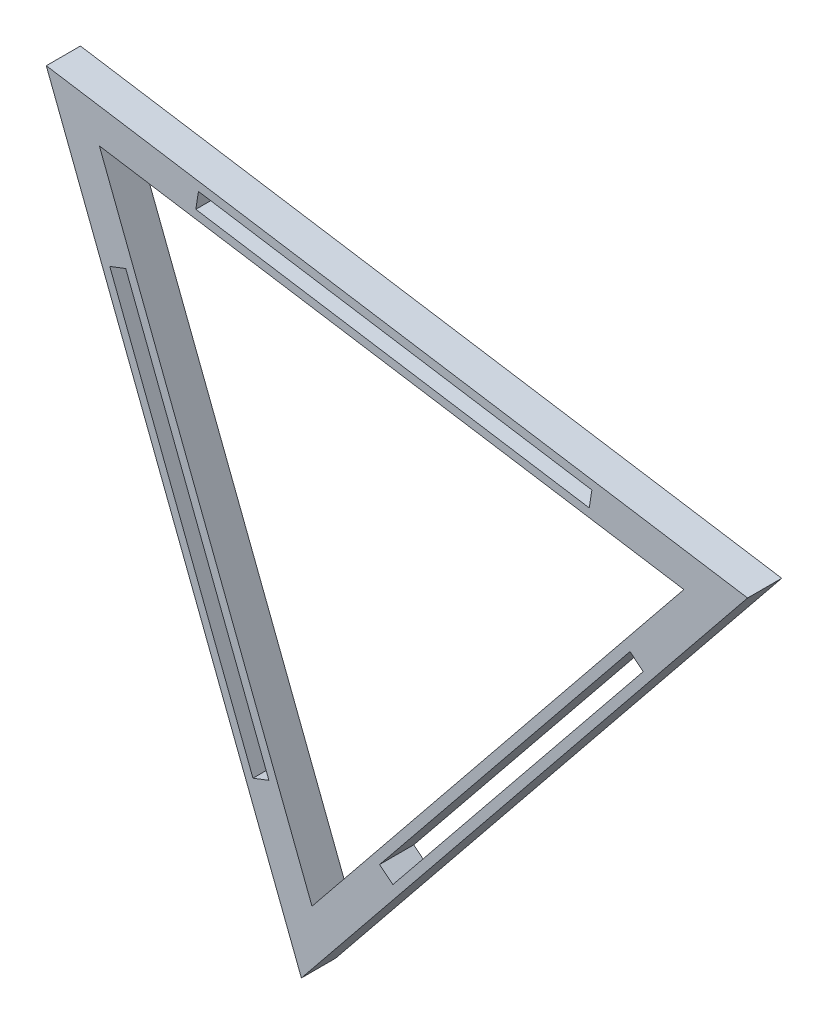
ISO-10303-21;
HEADER;
FILE_DESCRIPTION(('STEP AP214'),'2;1');
FILE_NAME('part.step','',(''),(''),'','','');
FILE_SCHEMA(('AUTOMOTIVE_DESIGN { 1 0 10303 214 1 1 1 1 }'));
ENDSEC;
DATA;
#1=APPLICATION_CONTEXT('core data for automotive mechanical design processes');
#2=APPLICATION_PROTOCOL_DEFINITION('international standard','automotive_design',2000,#1);
#3=PRODUCT_CONTEXT('',#1,'mechanical');
#4=PRODUCT('Part','Part','',(#3));
#5=PRODUCT_RELATED_PRODUCT_CATEGORY('part','',(#4));
#6=PRODUCT_DEFINITION_FORMATION('','',#4);
#7=PRODUCT_DEFINITION_CONTEXT('part definition',#1,'design');
#8=PRODUCT_DEFINITION('design','',#6,#7);
#9=PRODUCT_DEFINITION_SHAPE('','',#8);
#10=(LENGTH_UNIT() NAMED_UNIT(*) SI_UNIT(.MILLI.,.METRE.));
#11=(NAMED_UNIT(*) PLANE_ANGLE_UNIT() SI_UNIT($,.RADIAN.));
#12=(NAMED_UNIT(*) SI_UNIT($,.STERADIAN.) SOLID_ANGLE_UNIT());
#13=UNCERTAINTY_MEASURE_WITH_UNIT(LENGTH_MEASURE(1.E-05),#10,'distance_accuracy_value','');
#14=(GEOMETRIC_REPRESENTATION_CONTEXT(3) GLOBAL_UNCERTAINTY_ASSIGNED_CONTEXT((#13)) GLOBAL_UNIT_ASSIGNED_CONTEXT((#10,
#11,#12)) REPRESENTATION_CONTEXT('',''));
#15=CARTESIAN_POINT('',(0.,0.,0.));
#16=DIRECTION('',(0.,0.,1.));
#17=DIRECTION('',(1.,0.,0.));
#18=AXIS2_PLACEMENT_3D('',#15,#16,#17);
#19=CARTESIAN_POINT('',(0.,0.,6.));
#20=DIRECTION('',(0.,0.,-1.));
#21=DIRECTION('',(-1.,0.,0.));
#22=AXIS2_PLACEMENT_3D('',#19,#20,#21);
#23=PLANE('',#22);
#24=DIRECTION('',(0.155322392432012,0.987863833941296,0.));
#25=VECTOR('',#24,1.);
#26=CARTESIAN_POINT('',(11.977902000133,35.118415815889,6.));
#27=LINE('',#26,#25);
#28=CARTESIAN_POINT('',(11.977902000133,35.118415815889,6.));
#29=VERTEX_POINT('',#28);
#30=CARTESIAN_POINT('',(12.4438691774291,38.0820073177129,6.));
#31=VERTEX_POINT('',#30);
#32=EDGE_CURVE('E178',#29,#31,#27,.T.);
#33=ORIENTED_EDGE('',*,*,#32,.F.);
#34=DIRECTION('',(0.987863833941296,-0.155322392432012,0.));
#35=VECTOR('',#34,1.);
#36=CARTESIAN_POINT('',(-57.1725663757577,45.9909832861298,6.));
#37=LINE('',#36,#35);
#38=CARTESIAN_POINT('',(-57.1725663757577,45.9909832861298,6.));
#39=VERTEX_POINT('',#38);
#40=EDGE_CURVE('E48',#39,#29,#37,.T.);
#41=ORIENTED_EDGE('',*,*,#40,.F.);
#42=DIRECTION('',(0.155322392432012,0.987863833941296,0.));
#43=VECTOR('',#42,1.);
#44=CARTESIAN_POINT('',(-57.1725663757577,45.9909832861298,6.));
#45=LINE('',#44,#43);
#46=CARTESIAN_POINT('',(-56.7065991984616,48.9545747879537,6.));
#47=VERTEX_POINT('',#46);
#48=EDGE_CURVE('E166',#39,#47,#45,.T.);
#49=ORIENTED_EDGE('',*,*,#48,.T.);
#50=DIRECTION('',(0.987863833941296,-0.155322392432012,0.));
#51=VECTOR('',#50,1.);
#52=CARTESIAN_POINT('',(-56.7065991984616,48.9545747879537,6.));
#53=LINE('',#52,#51);
#54=EDGE_CURVE('E172',#47,#31,#53,.T.);
#55=ORIENTED_EDGE('',*,*,#54,.T.);
#56=EDGE_LOOP('',(#33,#41,#49,#55));
#57=FACE_BOUND('',#56,.T.);
#58=DIRECTION('',(0.628780940268043,0.777582490257873,0.));
#59=VECTOR('',#58,1.);
#60=CARTESIAN_POINT('',(-24.8720508241107,-37.5982954158554,6.));
#61=LINE('',#60,#59);
#62=CARTESIAN_POINT('',(-24.8720508241107,-37.5982954158554,6.));
#63=VERTEX_POINT('',#62);
#64=CARTESIAN_POINT('',(19.1426149946523,16.8324789021958,6.));
#65=VERTEX_POINT('',#64);
#66=EDGE_CURVE('E179',#63,#65,#61,.T.);
#67=ORIENTED_EDGE('',*,*,#66,.T.);
#68=DIRECTION('',(0.777582490257874,-0.628780940268043,0.));
#69=VECTOR('',#68,1.);
#70=CARTESIAN_POINT('',(19.1426149946523,16.8324789021958,6.));
#71=LINE('',#70,#69);
#72=CARTESIAN_POINT('',(21.4753624654259,14.9461360813916,6.));
#73=VERTEX_POINT('',#72);
#74=EDGE_CURVE('E182',#65,#73,#71,.T.);
#75=ORIENTED_EDGE('',*,*,#74,.T.);
#76=DIRECTION('',(0.628780940268043,0.777582490257873,0.));
#77=VECTOR('',#76,1.);
#78=CARTESIAN_POINT('',(-22.5393033533371,-39.4846382366595,6.));
#79=LINE('',#78,#77);
#80=CARTESIAN_POINT('',(-22.5393033533371,-39.4846382366595,6.));
#81=VERTEX_POINT('',#80);
#82=EDGE_CURVE('E207',#81,#73,#79,.T.);
#83=ORIENTED_EDGE('',*,*,#82,.F.);
#84=DIRECTION('',(0.777582490257873,-0.628780940268044,0.));
#85=VECTOR('',#84,1.);
#86=CARTESIAN_POINT('',(-24.8720508241107,-37.5982954158554,6.));
#87=LINE('',#86,#85);
#88=EDGE_CURVE('E210',#63,#81,#87,.T.);
#89=ORIENTED_EDGE('',*,*,#88,.F.);
#90=EDGE_LOOP('',(#67,#75,#83,#89));
#91=FACE_BOUND('',#90,.T.);
#92=DIRECTION('',(0.359354366991747,-0.933201178162544,0.));
#93=VECTOR('',#92,1.);
#94=CARTESIAN_POINT('',(-38.6140654621121,-61.7370820134851,6.));
#95=LINE('',#94,#93);
#96=CARTESIAN_POINT('',(-83.455959887873,54.7120627665518,6.));
#97=VERTEX_POINT('',#96);
#98=CARTESIAN_POINT('',(-38.6140654621121,-61.7370820134851,6.));
#99=VERTEX_POINT('',#98);
#100=EDGE_CURVE('E247',#97,#99,#95,.T.);
#101=ORIENTED_EDGE('',*,*,#100,.T.);
#102=DIRECTION('',(0.628498743634432,0.777810599857022,0.));
#103=VECTOR('',#102,1.);
#104=CARTESIAN_POINT('',(39.8129049534864,35.3217101030623,6.));
#105=LINE('',#104,#103);
#106=CARTESIAN_POINT('',(39.8129049534864,35.3217101030623,6.));
#107=VERTEX_POINT('',#106);
#108=EDGE_CURVE('E250',#99,#107,#105,.T.);
#109=ORIENTED_EDGE('',*,*,#108,.T.);
#110=DIRECTION('',(-0.987853110626204,0.155390578305548,0.));
#111=VECTOR('',#110,1.);
#112=CARTESIAN_POINT('',(-83.455959887873,54.7120627665518,6.));
#113=LINE('',#112,#111);
#114=EDGE_CURVE('E253',#107,#97,#113,.T.);
#115=ORIENTED_EDGE('',*,*,#114,.T.);
#116=EDGE_LOOP('',(#101,#109,#115));
#117=FACE_BOUND('',#116,.T.);
#118=DIRECTION('',(-0.987853110626204,0.155390578305548,0.));
#119=VECTOR('',#118,1.);
#120=CARTESIAN_POINT('',(-74.122232689589,47.1700778429383,6.));
#121=LINE('',#120,#119);
#122=CARTESIAN_POINT('',(28.6144908155362,31.0094576991613,6.));
#123=VERTEX_POINT('',#122);
#124=CARTESIAN_POINT('',(-74.122232689589,47.1700778429383,6.));
#125=VERTEX_POINT('',#124);
#126=EDGE_CURVE('E223',#123,#125,#121,.T.);
#127=ORIENTED_EDGE('',*,*,#126,.F.);
#128=DIRECTION('',(0.628498743634432,0.777810599857022,0.));
#129=VECTOR('',#128,1.);
#130=CARTESIAN_POINT('',(28.6144908155362,31.0094576991613,6.));
#131=LINE('',#130,#129);
#132=CARTESIAN_POINT('',(-36.7493785224458,-49.8828446859703,6.));
#133=VERTEX_POINT('',#132);
#134=EDGE_CURVE('E229',#133,#123,#131,.T.);
#135=ORIENTED_EDGE('',*,*,#134,.F.);
#136=DIRECTION('',(0.359354366991747,-0.933201178162544,0.));
#137=VECTOR('',#136,1.);
#138=CARTESIAN_POINT('',(-36.7493785224458,-49.8828446859703,6.));
#139=LINE('',#138,#137);
#140=EDGE_CURVE('E225',#125,#133,#139,.T.);
#141=ORIENTED_EDGE('',*,*,#140,.F.);
#142=EDGE_LOOP('',(#127,#135,#141));
#143=FACE_BOUND('',#142,.T.);
#144=DIRECTION('',(-0.359445221944692,0.933166186925529,0.));
#145=VECTOR('',#144,1.);
#146=CARTESIAN_POINT('',(-47.1278934841825,-35.5783196743348,6.));
#147=LINE('',#146,#145);
#148=CARTESIAN_POINT('',(-47.1278934841825,-35.5783196743348,6.));
#149=VERTEX_POINT('',#148);
#150=CARTESIAN_POINT('',(-72.2890590203109,29.7433134104523,6.));
#151=VERTEX_POINT('',#150);
#152=EDGE_CURVE('E56',#149,#151,#147,.T.);
#153=ORIENTED_EDGE('',*,*,#152,.T.);
#154=DIRECTION('',(0.933166186925529,0.359445221944691,0.));
#155=VECTOR('',#154,1.);
#156=CARTESIAN_POINT('',(-72.2890590203109,29.7433134104523,6.));
#157=LINE('',#156,#155);
#158=CARTESIAN_POINT('',(-69.4895604595343,30.8216490762864,6.));
#159=VERTEX_POINT('',#158);
#160=EDGE_CURVE('E201',#151,#159,#157,.T.);
#161=ORIENTED_EDGE('',*,*,#160,.T.);
#162=DIRECTION('',(-0.359445221944691,0.933166186925529,0.));
#163=VECTOR('',#162,1.);
#164=CARTESIAN_POINT('',(-44.3283949234059,-34.4999840085007,6.));
#165=LINE('',#164,#163);
#166=CARTESIAN_POINT('',(-44.3283949234059,-34.4999840085007,6.));
#167=VERTEX_POINT('',#166);
#168=EDGE_CURVE('E198',#167,#159,#165,.T.);
#169=ORIENTED_EDGE('',*,*,#168,.F.);
#170=DIRECTION('',(0.93316618692553,0.35944522194469,0.));
#171=VECTOR('',#170,1.);
#172=CARTESIAN_POINT('',(-47.1278934841825,-35.5783196743348,6.));
#173=LINE('',#172,#171);
#174=EDGE_CURVE('E195',#149,#167,#173,.T.);
#175=ORIENTED_EDGE('',*,*,#174,.F.);
#176=EDGE_LOOP('',(#153,#161,#169,#175));
#177=FACE_BOUND('',#176,.T.);
#178=ADVANCED_FACE('F33',(#57,#91,#117,#143,#177),#23,.F.);
#179=CARTESIAN_POINT('',(0.,0.,0.));
#180=DIRECTION('',(0.,0.,-1.));
#181=DIRECTION('',(-1.,0.,0.));
#182=AXIS2_PLACEMENT_3D('',#179,#180,#181);
#183=PLANE('',#182);
#184=DIRECTION('',(-0.987863833941296,0.155322392432012,0.));
#185=VECTOR('',#184,1.);
#186=CARTESIAN_POINT('',(5.67744493664427,36.1090402631996,0.));
#187=LINE('',#186,#185);
#188=CARTESIAN_POINT('',(11.977902000133,35.118415815889,0.));
#189=VERTEX_POINT('',#188);
#190=CARTESIAN_POINT('',(-57.1725663757577,45.9909832861298,0.));
#191=VERTEX_POINT('',#190);
#192=EDGE_CURVE('E11',#189,#191,#187,.T.);
#193=ORIENTED_EDGE('',*,*,#192,.F.);
#194=DIRECTION('',(-0.155322392432012,-0.987863833941296,0.));
#195=VECTOR('',#194,1.);
#196=CARTESIAN_POINT('',(6.30045706348877,-0.990624447310617,0.));
#197=LINE('',#196,#195);
#198=CARTESIAN_POINT('',(12.4438691774291,38.0820073177129,0.));
#199=VERTEX_POINT('',#198);
#200=EDGE_CURVE('E291',#199,#189,#197,.T.);
#201=ORIENTED_EDGE('',*,*,#200,.F.);
#202=DIRECTION('',(-0.987863833941296,0.155322392432012,0.));
#203=VECTOR('',#202,1.);
#204=CARTESIAN_POINT('',(6.14341211394031,39.0726317650235,0.));
#205=LINE('',#204,#203);
#206=CARTESIAN_POINT('',(-56.7065991984616,48.9545747879537,0.));
#207=VERTEX_POINT('',#206);
#208=EDGE_CURVE('E293',#199,#207,#205,.T.);
#209=ORIENTED_EDGE('',*,*,#208,.T.);
#210=DIRECTION('',(-0.155322392432012,-0.987863833941296,0.));
#211=VECTOR('',#210,1.);
#212=CARTESIAN_POINT('',(-62.850011312402,9.88194302293023,0.));
#213=LINE('',#212,#211);
#214=EDGE_CURVE('E41',#207,#191,#213,.T.);
#215=ORIENTED_EDGE('',*,*,#214,.T.);
#216=EDGE_LOOP('',(#193,#201,#209,#215));
#217=FACE_BOUND('',#216,.T.);
#218=DIRECTION('',(0.359354366991747,-0.933201178162544,0.));
#219=VECTOR('',#218,1.);
#220=CARTESIAN_POINT('',(-38.6140654621121,-61.7370820134851,0.));
#221=LINE('',#220,#219);
#222=CARTESIAN_POINT('',(-83.455959887873,54.7120627665518,0.));
#223=VERTEX_POINT('',#222);
#224=CARTESIAN_POINT('',(-38.6140654621121,-61.7370820134851,0.));
#225=VERTEX_POINT('',#224);
#226=EDGE_CURVE('E246',#223,#225,#221,.T.);
#227=ORIENTED_EDGE('',*,*,#226,.F.);
#228=DIRECTION('',(-0.987853110626204,0.155390578305548,0.));
#229=VECTOR('',#228,1.);
#230=CARTESIAN_POINT('',(-83.455959887873,54.7120627665518,0.));
#231=LINE('',#230,#229);
#232=CARTESIAN_POINT('',(39.8129049534864,35.3217101030623,0.));
#233=VERTEX_POINT('',#232);
#234=EDGE_CURVE('E251',#233,#223,#231,.T.);
#235=ORIENTED_EDGE('',*,*,#234,.F.);
#236=DIRECTION('',(0.628498743634432,0.777810599857022,0.));
#237=VECTOR('',#236,1.);
#238=CARTESIAN_POINT('',(39.8129049534864,35.3217101030623,0.));
#239=LINE('',#238,#237);
#240=EDGE_CURVE('E258',#225,#233,#239,.T.);
#241=ORIENTED_EDGE('',*,*,#240,.F.);
#242=EDGE_LOOP('',(#227,#235,#241));
#243=FACE_BOUND('',#242,.T.);
#244=DIRECTION('',(0.628498743634432,0.777810599857022,0.));
#245=VECTOR('',#244,1.);
#246=CARTESIAN_POINT('',(28.6144908155362,31.0094576991613,0.));
#247=LINE('',#246,#245);
#248=CARTESIAN_POINT('',(-36.7493785224458,-49.8828446859703,0.));
#249=VERTEX_POINT('',#248);
#250=CARTESIAN_POINT('',(28.6144908155363,31.0094576991613,0.));
#251=VERTEX_POINT('',#250);
#252=EDGE_CURVE('E226',#249,#251,#247,.T.);
#253=ORIENTED_EDGE('',*,*,#252,.T.);
#254=DIRECTION('',(-0.987853110626204,0.155390578305548,0.));
#255=VECTOR('',#254,1.);
#256=CARTESIAN_POINT('',(-74.122232689589,47.1700778429383,0.));
#257=LINE('',#256,#255);
#258=CARTESIAN_POINT('',(-74.122232689589,47.1700778429383,0.));
#259=VERTEX_POINT('',#258);
#260=EDGE_CURVE('E222',#251,#259,#257,.T.);
#261=ORIENTED_EDGE('',*,*,#260,.T.);
#262=DIRECTION('',(0.359354366991747,-0.933201178162544,0.));
#263=VECTOR('',#262,1.);
#264=CARTESIAN_POINT('',(-36.7493785224458,-49.8828446859703,0.));
#265=LINE('',#264,#263);
#266=EDGE_CURVE('E234',#259,#249,#265,.T.);
#267=ORIENTED_EDGE('',*,*,#266,.T.);
#268=EDGE_LOOP('',(#253,#261,#267));
#269=FACE_BOUND('',#268,.T.);
#270=DIRECTION('',(-0.777582490257874,0.628780940268043,0.));
#271=VECTOR('',#270,1.);
#272=CARTESIAN_POINT('',(15.7982168985812,19.5368785071571,0.));
#273=LINE('',#272,#271);
#274=CARTESIAN_POINT('',(21.4753624654259,14.9461360813916,0.));
#275=VERTEX_POINT('',#274);
#276=CARTESIAN_POINT('',(19.1426149946523,16.8324789021958,0.));
#277=VERTEX_POINT('',#276);
#278=EDGE_CURVE('E274',#275,#277,#273,.T.);
#279=ORIENTED_EDGE('',*,*,#278,.T.);
#280=DIRECTION('',(-0.628780940268043,-0.777582490257873,0.));
#281=VECTOR('',#280,1.);
#282=CARTESIAN_POINT('',(3.34439809607111,-2.70439960496134,0.));
#283=LINE('',#282,#281);
#284=CARTESIAN_POINT('',(-24.8720508241107,-37.5982954158554,0.));
#285=VERTEX_POINT('',#284);
#286=EDGE_CURVE('E277',#277,#285,#283,.T.);
#287=ORIENTED_EDGE('',*,*,#286,.T.);
#288=DIRECTION('',(-0.777582490257873,0.628780940268044,0.));
#289=VECTOR('',#288,1.);
#290=CARTESIAN_POINT('',(-28.2164489201819,-34.893895810894,0.));
#291=LINE('',#290,#289);
#292=CARTESIAN_POINT('',(-22.5393033533371,-39.4846382366595,0.));
#293=VERTEX_POINT('',#292);
#294=EDGE_CURVE('E269',#293,#285,#291,.T.);
#295=ORIENTED_EDGE('',*,*,#294,.F.);
#296=DIRECTION('',(-0.628780940268043,-0.777582490257873,0.));
#297=VECTOR('',#296,1.);
#298=CARTESIAN_POINT('',(5.67714556684474,-4.59074242576547,0.));
#299=LINE('',#298,#297);
#300=EDGE_CURVE('E271',#275,#293,#299,.T.);
#301=ORIENTED_EDGE('',*,*,#300,.F.);
#302=EDGE_LOOP('',(#279,#287,#295,#301));
#303=FACE_BOUND('',#302,.T.);
#304=DIRECTION('',(-0.933166186925529,-0.359445221944691,0.));
#305=VECTOR('',#304,1.);
#306=CARTESIAN_POINT('',(-19.3163745951238,50.1478014609147,0.));
#307=LINE('',#306,#305);
#308=CARTESIAN_POINT('',(-69.4895604595343,30.8216490762864,0.));
#309=VERTEX_POINT('',#308);
#310=CARTESIAN_POINT('',(-72.2890590203109,29.7433134104523,0.));
#311=VERTEX_POINT('',#310);
#312=EDGE_CURVE('E285',#309,#311,#307,.T.);
#313=ORIENTED_EDGE('',*,*,#312,.T.);
#314=DIRECTION('',(0.359445221944692,-0.933166186925529,0.));
#315=VECTOR('',#314,1.);
#316=CARTESIAN_POINT('',(-52.9726844251872,-20.4044880504624,0.));
#317=LINE('',#316,#315);
#318=CARTESIAN_POINT('',(-47.1278934841825,-35.5783196743348,0.));
#319=VERTEX_POINT('',#318);
#320=EDGE_CURVE('E288',#311,#319,#317,.T.);
#321=ORIENTED_EDGE('',*,*,#320,.T.);
#322=DIRECTION('',(-0.93316618692553,-0.35944522194469,0.));
#323=VECTOR('',#322,1.);
#324=CARTESIAN_POINT('',(5.84479094100466,-15.1738316238725,0.));
#325=LINE('',#324,#323);
#326=CARTESIAN_POINT('',(-44.3283949234059,-34.4999840085007,0.));
#327=VERTEX_POINT('',#326);
#328=EDGE_CURVE('E280',#327,#319,#325,.T.);
#329=ORIENTED_EDGE('',*,*,#328,.F.);
#330=DIRECTION('',(0.359445221944691,-0.933166186925529,0.));
#331=VECTOR('',#330,1.);
#332=CARTESIAN_POINT('',(-50.1731858644106,-19.3261523846283,0.));
#333=LINE('',#332,#331);
#334=EDGE_CURVE('E282',#309,#327,#333,.T.);
#335=ORIENTED_EDGE('',*,*,#334,.F.);
#336=EDGE_LOOP('',(#313,#321,#329,#335));
#337=FACE_BOUND('',#336,.T.);
#338=ADVANCED_FACE('F296',(#217,#243,#269,#303,#337),#183,.T.);
#339=CARTESIAN_POINT('',(-38.6140654621121,-61.7370820134851,6.));
#340=DIRECTION('',(0.933201178162544,0.359354366991747,0.));
#341=DIRECTION('',(-0.359354366991747,0.933201178162544,0.));
#342=AXIS2_PLACEMENT_3D('',#339,#340,#341);
#343=PLANE('',#342);
#344=ORIENTED_EDGE('',*,*,#226,.T.);
#345=DIRECTION('',(0.,0.,-1.));
#346=VECTOR('',#345,1.);
#347=CARTESIAN_POINT('',(-38.6140654621121,-61.7370820134851,6.));
#348=LINE('',#347,#346);
#349=EDGE_CURVE('E266',#99,#225,#348,.T.);
#350=ORIENTED_EDGE('',*,*,#349,.F.);
#351=ORIENTED_EDGE('',*,*,#100,.F.);
#352=DIRECTION('',(0.,0.,-1.));
#353=VECTOR('',#352,1.);
#354=CARTESIAN_POINT('',(-83.455959887873,54.7120627665518,6.));
#355=LINE('',#354,#353);
#356=EDGE_CURVE('E255',#97,#223,#355,.T.);
#357=ORIENTED_EDGE('',*,*,#356,.T.);
#358=EDGE_LOOP('',(#344,#350,#351,#357));
#359=FACE_BOUND('',#358,.T.);
#360=ADVANCED_FACE('F35',(#359),#343,.F.);
#361=CARTESIAN_POINT('',(39.8129049534864,35.3217101030623,6.));
#362=DIRECTION('',(-0.777810599857022,0.628498743634432,0.));
#363=DIRECTION('',(-0.628498743634432,-0.777810599857022,0.));
#364=AXIS2_PLACEMENT_3D('',#361,#362,#363);
#365=PLANE('',#364);
#366=ORIENTED_EDGE('',*,*,#240,.T.);
#367=DIRECTION('',(0.,0.,-1.));
#368=VECTOR('',#367,1.);
#369=CARTESIAN_POINT('',(39.8129049534864,35.3217101030623,6.));
#370=LINE('',#369,#368);
#371=EDGE_CURVE('E263',#107,#233,#370,.T.);
#372=ORIENTED_EDGE('',*,*,#371,.F.);
#373=ORIENTED_EDGE('',*,*,#108,.F.);
#374=ORIENTED_EDGE('',*,*,#349,.T.);
#375=EDGE_LOOP('',(#366,#372,#373,#374));
#376=FACE_BOUND('',#375,.T.);
#377=ADVANCED_FACE('F327',(#376),#365,.F.);
#378=CARTESIAN_POINT('',(-83.455959887873,54.7120627665518,6.));
#379=DIRECTION('',(-0.155390578305548,-0.987853110626204,0.));
#380=DIRECTION('',(0.987853110626204,-0.155390578305548,0.));
#381=AXIS2_PLACEMENT_3D('',#378,#379,#380);
#382=PLANE('',#381);
#383=ORIENTED_EDGE('',*,*,#234,.T.);
#384=ORIENTED_EDGE('',*,*,#356,.F.);
#385=ORIENTED_EDGE('',*,*,#114,.F.);
#386=ORIENTED_EDGE('',*,*,#371,.T.);
#387=EDGE_LOOP('',(#383,#384,#385,#386));
#388=FACE_BOUND('',#387,.T.);
#389=ADVANCED_FACE('F325',(#388),#382,.F.);
#390=CARTESIAN_POINT('',(-74.122232689589,47.1700778429383,6.));
#391=DIRECTION('',(-0.155390578305548,-0.987853110626204,0.));
#392=DIRECTION('',(0.987853110626204,-0.155390578305548,0.));
#393=AXIS2_PLACEMENT_3D('',#390,#391,#392);
#394=PLANE('',#393);
#395=ORIENTED_EDGE('',*,*,#260,.F.);
#396=DIRECTION('',(0.,0.,-1.));
#397=VECTOR('',#396,1.);
#398=CARTESIAN_POINT('',(28.6144908155362,31.0094576991613,6.));
#399=LINE('',#398,#397);
#400=EDGE_CURVE('E231',#123,#251,#399,.T.);
#401=ORIENTED_EDGE('',*,*,#400,.F.);
#402=ORIENTED_EDGE('',*,*,#126,.T.);
#403=DIRECTION('',(0.,0.,-1.));
#404=VECTOR('',#403,1.);
#405=CARTESIAN_POINT('',(-74.122232689589,47.1700778429383,6.));
#406=LINE('',#405,#404);
#407=EDGE_CURVE('E243',#125,#259,#406,.T.);
#408=ORIENTED_EDGE('',*,*,#407,.T.);
#409=EDGE_LOOP('',(#395,#401,#402,#408));
#410=FACE_BOUND('',#409,.T.);
#411=ADVANCED_FACE('F322',(#410),#394,.T.);
#412=CARTESIAN_POINT('',(-36.7493785224458,-49.8828446859703,6.));
#413=DIRECTION('',(0.933201178162544,0.359354366991747,0.));
#414=DIRECTION('',(-0.359354366991747,0.933201178162544,0.));
#415=AXIS2_PLACEMENT_3D('',#412,#413,#414);
#416=PLANE('',#415);
#417=ORIENTED_EDGE('',*,*,#266,.F.);
#418=ORIENTED_EDGE('',*,*,#407,.F.);
#419=ORIENTED_EDGE('',*,*,#140,.T.);
#420=DIRECTION('',(0.,0.,-1.));
#421=VECTOR('',#420,1.);
#422=CARTESIAN_POINT('',(-36.7493785224458,-49.8828446859703,6.));
#423=LINE('',#422,#421);
#424=EDGE_CURVE('E241',#133,#249,#423,.T.);
#425=ORIENTED_EDGE('',*,*,#424,.T.);
#426=EDGE_LOOP('',(#417,#418,#419,#425));
#427=FACE_BOUND('',#426,.T.);
#428=ADVANCED_FACE('F392',(#427),#416,.T.);
#429=CARTESIAN_POINT('',(28.6144908155362,31.0094576991613,6.));
#430=DIRECTION('',(-0.777810599857022,0.628498743634432,0.));
#431=DIRECTION('',(-0.628498743634432,-0.777810599857022,0.));
#432=AXIS2_PLACEMENT_3D('',#429,#430,#431);
#433=PLANE('',#432);
#434=ORIENTED_EDGE('',*,*,#252,.F.);
#435=ORIENTED_EDGE('',*,*,#424,.F.);
#436=ORIENTED_EDGE('',*,*,#134,.T.);
#437=ORIENTED_EDGE('',*,*,#400,.T.);
#438=EDGE_LOOP('',(#434,#435,#436,#437));
#439=FACE_BOUND('',#438,.T.);
#440=ADVANCED_FACE('F389',(#439),#433,.T.);
#441=CARTESIAN_POINT('',(-24.8720508241107,-37.5982954158554,-4.));
#442=DIRECTION('',(0.777582490257873,-0.628780940268043,0.));
#443=DIRECTION('',(0.628780940268043,0.777582490257873,0.));
#444=AXIS2_PLACEMENT_3D('',#441,#442,#443);
#445=PLANE('',#444);
#446=DIRECTION('',(0.,0.,1.));
#447=VECTOR('',#446,1.);
#448=CARTESIAN_POINT('',(19.1426149946523,16.8324789021958,-4.));
#449=LINE('',#448,#447);
#450=EDGE_CURVE('E220',#277,#65,#449,.T.);
#451=ORIENTED_EDGE('',*,*,#450,.T.);
#452=ORIENTED_EDGE('',*,*,#66,.F.);
#453=DIRECTION('',(0.,0.,1.));
#454=VECTOR('',#453,1.);
#455=CARTESIAN_POINT('',(-24.8720508241107,-37.5982954158554,-4.));
#456=LINE('',#455,#454);
#457=EDGE_CURVE('E213',#285,#63,#456,.T.);
#458=ORIENTED_EDGE('',*,*,#457,.F.);
#459=ORIENTED_EDGE('',*,*,#286,.F.);
#460=EDGE_LOOP('',(#451,#452,#458,#459));
#461=FACE_BOUND('',#460,.T.);
#462=ADVANCED_FACE('F385',(#461),#445,.T.);
#463=CARTESIAN_POINT('',(19.1426149946523,16.8324789021958,-4.));
#464=DIRECTION('',(-0.628780940268043,-0.777582490257874,0.));
#465=DIRECTION('',(0.777582490257874,-0.628780940268043,0.));
#466=AXIS2_PLACEMENT_3D('',#463,#464,#465);
#467=PLANE('',#466);
#468=DIRECTION('',(0.,0.,1.));
#469=VECTOR('',#468,1.);
#470=CARTESIAN_POINT('',(21.4753624654259,14.9461360813916,-4.));
#471=LINE('',#470,#469);
#472=EDGE_CURVE('E218',#275,#73,#471,.T.);
#473=ORIENTED_EDGE('',*,*,#472,.T.);
#474=ORIENTED_EDGE('',*,*,#74,.F.);
#475=ORIENTED_EDGE('',*,*,#450,.F.);
#476=ORIENTED_EDGE('',*,*,#278,.F.);
#477=EDGE_LOOP('',(#473,#474,#475,#476));
#478=FACE_BOUND('',#477,.T.);
#479=ADVANCED_FACE('F381',(#478),#467,.T.);
#480=CARTESIAN_POINT('',(-22.5393033533371,-39.4846382366595,-4.));
#481=DIRECTION('',(0.777582490257873,-0.628780940268043,0.));
#482=DIRECTION('',(0.628780940268043,0.777582490257873,0.));
#483=AXIS2_PLACEMENT_3D('',#480,#481,#482);
#484=PLANE('',#483);
#485=ORIENTED_EDGE('',*,*,#300,.T.);
#486=DIRECTION('',(0.,0.,1.));
#487=VECTOR('',#486,1.);
#488=CARTESIAN_POINT('',(-22.5393033533371,-39.4846382366595,-4.));
#489=LINE('',#488,#487);
#490=EDGE_CURVE('E216',#293,#81,#489,.T.);
#491=ORIENTED_EDGE('',*,*,#490,.T.);
#492=ORIENTED_EDGE('',*,*,#82,.T.);
#493=ORIENTED_EDGE('',*,*,#472,.F.);
#494=EDGE_LOOP('',(#485,#491,#492,#493));
#495=FACE_BOUND('',#494,.T.);
#496=ADVANCED_FACE('F377',(#495),#484,.F.);
#497=CARTESIAN_POINT('',(-24.8720508241107,-37.5982954158554,-4.));
#498=DIRECTION('',(-0.628780940268044,-0.777582490257873,0.));
#499=DIRECTION('',(0.777582490257873,-0.628780940268044,0.));
#500=AXIS2_PLACEMENT_3D('',#497,#498,#499);
#501=PLANE('',#500);
#502=ORIENTED_EDGE('',*,*,#294,.T.);
#503=ORIENTED_EDGE('',*,*,#457,.T.);
#504=ORIENTED_EDGE('',*,*,#88,.T.);
#505=ORIENTED_EDGE('',*,*,#490,.F.);
#506=EDGE_LOOP('',(#502,#503,#504,#505));
#507=FACE_BOUND('',#506,.T.);
#508=ADVANCED_FACE('F374',(#507),#501,.F.);
#509=CARTESIAN_POINT('',(-47.1278934841825,-35.5783196743348,-4.));
#510=DIRECTION('',(0.933166186925529,0.359445221944692,0.));
#511=DIRECTION('',(-0.359445221944692,0.933166186925529,0.));
#512=AXIS2_PLACEMENT_3D('',#509,#510,#511);
#513=PLANE('',#512);
#514=DIRECTION('',(0.,0.,1.));
#515=VECTOR('',#514,1.);
#516=CARTESIAN_POINT('',(-72.2890590203109,29.7433134104523,-4.));
#517=LINE('',#516,#515);
#518=EDGE_CURVE('E187',#311,#151,#517,.T.);
#519=ORIENTED_EDGE('',*,*,#518,.T.);
#520=ORIENTED_EDGE('',*,*,#152,.F.);
#521=DIRECTION('',(0.,0.,1.));
#522=VECTOR('',#521,1.);
#523=CARTESIAN_POINT('',(-47.1278934841825,-35.5783196743348,-4.));
#524=LINE('',#523,#522);
#525=EDGE_CURVE('E193',#319,#149,#524,.T.);
#526=ORIENTED_EDGE('',*,*,#525,.F.);
#527=ORIENTED_EDGE('',*,*,#320,.F.);
#528=EDGE_LOOP('',(#519,#520,#526,#527));
#529=FACE_BOUND('',#528,.T.);
#530=ADVANCED_FACE('F355',(#529),#513,.T.);
#531=CARTESIAN_POINT('',(-72.2890590203109,29.7433134104523,-4.));
#532=DIRECTION('',(0.359445221944691,-0.933166186925529,0.));
#533=DIRECTION('',(0.933166186925529,0.359445221944691,0.));
#534=AXIS2_PLACEMENT_3D('',#531,#532,#533);
#535=PLANE('',#534);
#536=DIRECTION('',(0.,0.,1.));
#537=VECTOR('',#536,1.);
#538=CARTESIAN_POINT('',(-69.4895604595343,30.8216490762864,-4.));
#539=LINE('',#538,#537);
#540=EDGE_CURVE('E189',#309,#159,#539,.T.);
#541=ORIENTED_EDGE('',*,*,#540,.T.);
#542=ORIENTED_EDGE('',*,*,#160,.F.);
#543=ORIENTED_EDGE('',*,*,#518,.F.);
#544=ORIENTED_EDGE('',*,*,#312,.F.);
#545=EDGE_LOOP('',(#541,#542,#543,#544));
#546=FACE_BOUND('',#545,.T.);
#547=ADVANCED_FACE('F361',(#546),#535,.T.);
#548=CARTESIAN_POINT('',(-44.3283949234059,-34.4999840085007,-4.));
#549=DIRECTION('',(0.933166186925529,0.359445221944691,0.));
#550=DIRECTION('',(-0.359445221944691,0.933166186925529,0.));
#551=AXIS2_PLACEMENT_3D('',#548,#549,#550);
#552=PLANE('',#551);
#553=ORIENTED_EDGE('',*,*,#334,.T.);
#554=DIRECTION('',(0.,0.,1.));
#555=VECTOR('',#554,1.);
#556=CARTESIAN_POINT('',(-44.3283949234059,-34.4999840085007,-4.));
#557=LINE('',#556,#555);
#558=EDGE_CURVE('E191',#327,#167,#557,.T.);
#559=ORIENTED_EDGE('',*,*,#558,.T.);
#560=ORIENTED_EDGE('',*,*,#168,.T.);
#561=ORIENTED_EDGE('',*,*,#540,.F.);
#562=EDGE_LOOP('',(#553,#559,#560,#561));
#563=FACE_BOUND('',#562,.T.);
#564=ADVANCED_FACE('F363',(#563),#552,.F.);
#565=CARTESIAN_POINT('',(-47.1278934841825,-35.5783196743348,-4.));
#566=DIRECTION('',(0.35944522194469,-0.93316618692553,0.));
#567=DIRECTION('',(0.93316618692553,0.35944522194469,0.));
#568=AXIS2_PLACEMENT_3D('',#565,#566,#567);
#569=PLANE('',#568);
#570=ORIENTED_EDGE('',*,*,#328,.T.);
#571=ORIENTED_EDGE('',*,*,#525,.T.);
#572=ORIENTED_EDGE('',*,*,#174,.T.);
#573=ORIENTED_EDGE('',*,*,#558,.F.);
#574=EDGE_LOOP('',(#570,#571,#572,#573));
#575=FACE_BOUND('',#574,.T.);
#576=ADVANCED_FACE('F353',(#575),#569,.F.);
#577=CARTESIAN_POINT('',(-57.1725663757577,45.9909832861298,-4.));
#578=DIRECTION('',(-0.155322392432012,-0.987863833941296,0.));
#579=DIRECTION('',(0.987863833941296,-0.155322392432012,0.));
#580=AXIS2_PLACEMENT_3D('',#577,#578,#579);
#581=PLANE('',#580);
#582=ORIENTED_EDGE('',*,*,#192,.T.);
#583=DIRECTION('',(0.,0.,1.));
#584=VECTOR('',#583,1.);
#585=CARTESIAN_POINT('',(-57.1725663757577,45.9909832861298,-4.));
#586=LINE('',#585,#584);
#587=EDGE_CURVE('E157',#191,#39,#586,.T.);
#588=ORIENTED_EDGE('',*,*,#587,.T.);
#589=ORIENTED_EDGE('',*,*,#40,.T.);
#590=DIRECTION('',(0.,0.,1.));
#591=VECTOR('',#590,1.);
#592=CARTESIAN_POINT('',(11.977902000133,35.118415815889,-4.));
#593=LINE('',#592,#591);
#594=EDGE_CURVE('E173',#189,#29,#593,.T.);
#595=ORIENTED_EDGE('',*,*,#594,.F.);
#596=EDGE_LOOP('',(#582,#588,#589,#595));
#597=FACE_BOUND('',#596,.T.);
#598=ADVANCED_FACE('F159',(#597),#581,.F.);
#599=CARTESIAN_POINT('',(-57.1725663757577,45.9909832861298,-4.));
#600=DIRECTION('',(0.987863833941296,-0.155322392432012,0.));
#601=DIRECTION('',(0.155322392432012,0.987863833941296,0.));
#602=AXIS2_PLACEMENT_3D('',#599,#600,#601);
#603=PLANE('',#602);
#604=DIRECTION('',(0.,0.,1.));
#605=VECTOR('',#604,1.);
#606=CARTESIAN_POINT('',(-56.7065991984616,48.9545747879537,-4.));
#607=LINE('',#606,#605);
#608=EDGE_CURVE('E163',#207,#47,#607,.T.);
#609=ORIENTED_EDGE('',*,*,#608,.T.);
#610=ORIENTED_EDGE('',*,*,#48,.F.);
#611=ORIENTED_EDGE('',*,*,#587,.F.);
#612=ORIENTED_EDGE('',*,*,#214,.F.);
#613=EDGE_LOOP('',(#609,#610,#611,#612));
#614=FACE_BOUND('',#613,.T.);
#615=ADVANCED_FACE('F167',(#614),#603,.T.);
#616=CARTESIAN_POINT('',(-56.7065991984616,48.9545747879537,-4.));
#617=DIRECTION('',(-0.155322392432012,-0.987863833941296,0.));
#618=DIRECTION('',(0.987863833941296,-0.155322392432012,0.));
#619=AXIS2_PLACEMENT_3D('',#616,#617,#618);
#620=PLANE('',#619);
#621=DIRECTION('',(0.,0.,1.));
#622=VECTOR('',#621,1.);
#623=CARTESIAN_POINT('',(12.4438691774291,38.0820073177129,-4.));
#624=LINE('',#623,#622);
#625=EDGE_CURVE('E302',#199,#31,#624,.T.);
#626=ORIENTED_EDGE('',*,*,#625,.T.);
#627=ORIENTED_EDGE('',*,*,#54,.F.);
#628=ORIENTED_EDGE('',*,*,#608,.F.);
#629=ORIENTED_EDGE('',*,*,#208,.F.);
#630=EDGE_LOOP('',(#626,#627,#628,#629));
#631=FACE_BOUND('',#630,.T.);
#632=ADVANCED_FACE('F301',(#631),#620,.T.);
#633=CARTESIAN_POINT('',(11.977902000133,35.118415815889,-4.));
#634=DIRECTION('',(0.987863833941296,-0.155322392432012,0.));
#635=DIRECTION('',(0.155322392432012,0.987863833941296,0.));
#636=AXIS2_PLACEMENT_3D('',#633,#634,#635);
#637=PLANE('',#636);
#638=ORIENTED_EDGE('',*,*,#200,.T.);
#639=ORIENTED_EDGE('',*,*,#594,.T.);
#640=ORIENTED_EDGE('',*,*,#32,.T.);
#641=ORIENTED_EDGE('',*,*,#625,.F.);
#642=EDGE_LOOP('',(#638,#639,#640,#641));
#643=FACE_BOUND('',#642,.T.);
#644=ADVANCED_FACE('F307',(#643),#637,.F.);
#645=CLOSED_SHELL('',(#178,#338,#360,#377,#389,#411,#428,#440,#462,#479,#496,#508,#530,#547,
#564,#576,#598,#615,#632,#644));
#646=MANIFOLD_SOLID_BREP('B2',#645);
#647=ADVANCED_BREP_SHAPE_REPRESENTATION('',(#18,#646),#14);
#648=SHAPE_DEFINITION_REPRESENTATION(#9,#647);
ENDSEC;
END-ISO-10303-21;
